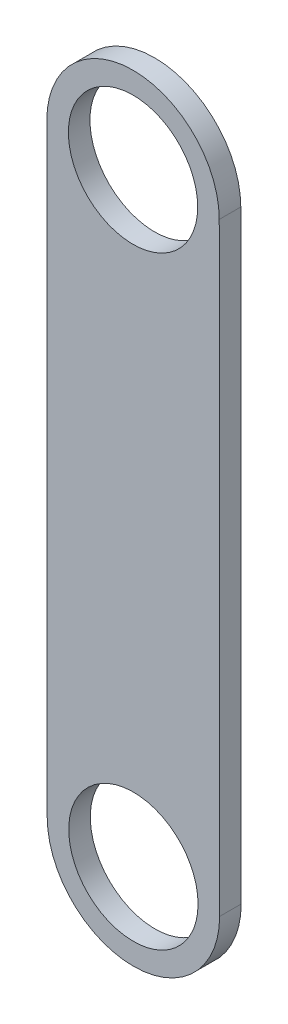
ISO-10303-21;
HEADER;
FILE_DESCRIPTION(('STEP AP214'),'2;1');
FILE_NAME('part.step','',(''),(''),'','','');
FILE_SCHEMA(('AUTOMOTIVE_DESIGN { 1 0 10303 214 1 1 1 1 }'));
ENDSEC;
DATA;
#1=APPLICATION_CONTEXT('core data for automotive mechanical design processes');
#2=APPLICATION_PROTOCOL_DEFINITION('international standard','automotive_design',2000,#1);
#3=PRODUCT_CONTEXT('',#1,'mechanical');
#4=PRODUCT('Part','Part','',(#3));
#5=PRODUCT_RELATED_PRODUCT_CATEGORY('part','',(#4));
#6=PRODUCT_DEFINITION_FORMATION('','',#4);
#7=PRODUCT_DEFINITION_CONTEXT('part definition',#1,'design');
#8=PRODUCT_DEFINITION('design','',#6,#7);
#9=PRODUCT_DEFINITION_SHAPE('','',#8);
#10=(LENGTH_UNIT() NAMED_UNIT(*) SI_UNIT(.MILLI.,.METRE.));
#11=(NAMED_UNIT(*) PLANE_ANGLE_UNIT() SI_UNIT($,.RADIAN.));
#12=(NAMED_UNIT(*) SI_UNIT($,.STERADIAN.) SOLID_ANGLE_UNIT());
#13=UNCERTAINTY_MEASURE_WITH_UNIT(LENGTH_MEASURE(1.E-05),#10,'distance_accuracy_value','');
#14=(GEOMETRIC_REPRESENTATION_CONTEXT(3) GLOBAL_UNCERTAINTY_ASSIGNED_CONTEXT((#13)) GLOBAL_UNIT_ASSIGNED_CONTEXT((#10,
#11,#12)) REPRESENTATION_CONTEXT('',''));
#15=CARTESIAN_POINT('',(0.,0.,0.));
#16=DIRECTION('',(0.,0.,1.));
#17=DIRECTION('',(1.,0.,0.));
#18=AXIS2_PLACEMENT_3D('',#15,#16,#17);
#19=CARTESIAN_POINT('',(-31.7651022120724,-5.87017847864854,-1.));
#20=DIRECTION('',(0.,0.,1.));
#21=DIRECTION('',(1.,0.,0.));
#22=AXIS2_PLACEMENT_3D('',#19,#20,#21);
#23=CYLINDRICAL_SURFACE('',#22,4.00000000000001);
#24=CARTESIAN_POINT('',(-31.7651022120724,-5.87017847864854,0.));
#25=DIRECTION('',(0.,0.,1.));
#26=DIRECTION('',(1.,0.,0.));
#27=AXIS2_PLACEMENT_3D('',#24,#25,#26);
#28=CIRCLE('',#27,4.00000000000001);
#29=CARTESIAN_POINT('',(-27.7651029568962,-5.86773745627963,0.));
#30=VERTEX_POINT('',#29);
#31=CARTESIAN_POINT('',(-35.7651014672485,-5.87261950101745,0.));
#32=VERTEX_POINT('',#31);
#33=EDGE_CURVE('E106',#30,#32,#28,.T.);
#34=ORIENTED_EDGE('',*,*,#33,.F.);
#35=DIRECTION('',(0.,0.,1.));
#36=VECTOR('',#35,1.);
#37=CARTESIAN_POINT('',(-27.7651029568962,-5.86773745627963,-1.));
#38=LINE('',#37,#36);
#39=CARTESIAN_POINT('',(-27.7651029568962,-5.86773745627963,-1.));
#40=VERTEX_POINT('',#39);
#41=EDGE_CURVE('E11',#40,#30,#38,.T.);
#42=ORIENTED_EDGE('',*,*,#41,.F.);
#43=CARTESIAN_POINT('',(-31.7651022120724,-5.87017847864854,-1.));
#44=DIRECTION('',(0.,0.,1.));
#45=DIRECTION('',(1.,0.,0.));
#46=AXIS2_PLACEMENT_3D('',#43,#44,#45);
#47=CIRCLE('',#46,4.00000000000001);
#48=CARTESIAN_POINT('',(-35.7651014672485,-5.87261950101745,-1.));
#49=VERTEX_POINT('',#48);
#50=EDGE_CURVE('E99',#40,#49,#47,.T.);
#51=ORIENTED_EDGE('',*,*,#50,.T.);
#52=DIRECTION('',(0.,0.,1.));
#53=VECTOR('',#52,1.);
#54=CARTESIAN_POINT('',(-35.7651014672485,-5.87261950101745,-1.));
#55=LINE('',#54,#53);
#56=EDGE_CURVE('E44',#49,#32,#55,.T.);
#57=ORIENTED_EDGE('',*,*,#56,.T.);
#58=EDGE_LOOP('',(#34,#42,#51,#57));
#59=FACE_BOUND('',#58,.T.);
#60=ADVANCED_FACE('F41',(#59),#23,.T.);
#61=CARTESIAN_POINT('',(-27.7651029568962,-5.86773745627963,-1.));
#62=DIRECTION('',(0.999999813794039,0.000610255592226298,0.));
#63=DIRECTION('',(-0.000610255592226298,0.999999813794039,0.));
#64=AXIS2_PLACEMENT_3D('',#61,#62,#63);
#65=PLANE('',#64);
#66=DIRECTION('',(-0.000610255592226298,0.999999813794039,0.));
#67=VECTOR('',#66,1.);
#68=CARTESIAN_POINT('',(-27.7651029568962,-5.86773745627963,0.));
#69=LINE('',#68,#67);
#70=CARTESIAN_POINT('',(-27.7480158003139,-33.8677322425127,0.));
#71=VERTEX_POINT('',#70);
#72=EDGE_CURVE('E101',#71,#30,#69,.T.);
#73=ORIENTED_EDGE('',*,*,#72,.F.);
#74=DIRECTION('',(0.,0.,1.));
#75=VECTOR('',#74,1.);
#76=CARTESIAN_POINT('',(-27.7480158003139,-33.8677322425127,-1.));
#77=LINE('',#76,#75);
#78=CARTESIAN_POINT('',(-27.7480158003139,-33.8677322425127,-1.));
#79=VERTEX_POINT('',#78);
#80=EDGE_CURVE('E50',#79,#71,#77,.T.);
#81=ORIENTED_EDGE('',*,*,#80,.F.);
#82=DIRECTION('',(-0.000610255592226298,0.999999813794039,0.));
#83=VECTOR('',#82,1.);
#84=CARTESIAN_POINT('',(-27.7651029568962,-5.86773745627963,-1.));
#85=LINE('',#84,#83);
#86=EDGE_CURVE('E96',#79,#40,#85,.T.);
#87=ORIENTED_EDGE('',*,*,#86,.T.);
#88=ORIENTED_EDGE('',*,*,#41,.T.);
#89=EDGE_LOOP('',(#73,#81,#87,#88));
#90=FACE_BOUND('',#89,.T.);
#91=ADVANCED_FACE('F117',(#90),#65,.T.);
#92=CARTESIAN_POINT('',(-31.74801505549,-33.8701732648816,-1.));
#93=DIRECTION('',(0.,0.,1.));
#94=DIRECTION('',(1.,0.,0.));
#95=AXIS2_PLACEMENT_3D('',#92,#93,#94);
#96=CYLINDRICAL_SURFACE('',#95,4.);
#97=CARTESIAN_POINT('',(-31.74801505549,-33.8701732648816,0.));
#98=DIRECTION('',(0.,0.,1.));
#99=DIRECTION('',(1.,0.,0.));
#100=AXIS2_PLACEMENT_3D('',#97,#98,#99);
#101=CIRCLE('',#100,4.);
#102=CARTESIAN_POINT('',(-35.7480143106662,-33.8726142872505,0.));
#103=VERTEX_POINT('',#102);
#104=EDGE_CURVE('E91',#103,#71,#101,.T.);
#105=ORIENTED_EDGE('',*,*,#104,.F.);
#106=DIRECTION('',(0.,0.,1.));
#107=VECTOR('',#106,1.);
#108=CARTESIAN_POINT('',(-35.7480143106662,-33.8726142872505,-1.));
#109=LINE('',#108,#107);
#110=CARTESIAN_POINT('',(-35.7480143106662,-33.8726142872505,-1.));
#111=VERTEX_POINT('',#110);
#112=EDGE_CURVE('E86',#111,#103,#109,.T.);
#113=ORIENTED_EDGE('',*,*,#112,.F.);
#114=CARTESIAN_POINT('',(-31.74801505549,-33.8701732648816,-1.));
#115=DIRECTION('',(0.,0.,1.));
#116=DIRECTION('',(1.,0.,0.));
#117=AXIS2_PLACEMENT_3D('',#114,#115,#116);
#118=CIRCLE('',#117,4.);
#119=EDGE_CURVE('E89',#111,#79,#118,.T.);
#120=ORIENTED_EDGE('',*,*,#119,.T.);
#121=ORIENTED_EDGE('',*,*,#80,.T.);
#122=EDGE_LOOP('',(#105,#113,#120,#121));
#123=FACE_BOUND('',#122,.T.);
#124=ADVANCED_FACE('F88',(#123),#96,.T.);
#125=CARTESIAN_POINT('',(-35.7651014672485,-5.87261950101745,-1.));
#126=DIRECTION('',(-0.999999813794039,-0.000610255592226794,0.));
#127=DIRECTION('',(0.000610255592226794,-0.999999813794039,0.));
#128=AXIS2_PLACEMENT_3D('',#125,#126,#127);
#129=PLANE('',#128);
#130=DIRECTION('',(0.000610255592226794,-0.999999813794039,0.));
#131=VECTOR('',#130,1.);
#132=CARTESIAN_POINT('',(-35.7651014672485,-5.87261950101745,0.));
#133=LINE('',#132,#131);
#134=EDGE_CURVE('E109',#32,#103,#133,.T.);
#135=ORIENTED_EDGE('',*,*,#134,.F.);
#136=ORIENTED_EDGE('',*,*,#56,.F.);
#137=DIRECTION('',(0.000610255592226794,-0.999999813794039,0.));
#138=VECTOR('',#137,1.);
#139=CARTESIAN_POINT('',(-35.7651014672485,-5.87261950101745,-1.));
#140=LINE('',#139,#138);
#141=EDGE_CURVE('E95',#49,#111,#140,.T.);
#142=ORIENTED_EDGE('',*,*,#141,.T.);
#143=ORIENTED_EDGE('',*,*,#112,.T.);
#144=EDGE_LOOP('',(#135,#136,#142,#143));
#145=FACE_BOUND('',#144,.T.);
#146=ADVANCED_FACE('F98',(#145),#129,.T.);
#147=CARTESIAN_POINT('',(-31.7651022120724,-5.87017847864854,-1.));
#148=DIRECTION('',(0.,0.,1.));
#149=DIRECTION('',(1.,0.,0.));
#150=AXIS2_PLACEMENT_3D('',#147,#148,#149);
#151=PLANE('',#150);
#152=CARTESIAN_POINT('',(-31.74801505549,-33.8701732648816,-1.));
#153=DIRECTION('',(0.,0.,1.));
#154=DIRECTION('',(1.,0.,0.));
#155=AXIS2_PLACEMENT_3D('',#152,#153,#154);
#156=CIRCLE('',#155,3.);
#157=CARTESIAN_POINT('',(-28.74801505549,-33.8701732648816,-1.));
#158=VERTEX_POINT('',#157);
#159=EDGE_CURVE('E150',#158,#158,#156,.T.);
#160=ORIENTED_EDGE('',*,*,#159,.T.);
#161=EDGE_LOOP('',(#160));
#162=FACE_BOUND('',#161,.T.);
#163=CARTESIAN_POINT('',(-31.7651022120724,-5.87017847864854,-1.));
#164=DIRECTION('',(0.,0.,1.));
#165=DIRECTION('',(1.,0.,0.));
#166=AXIS2_PLACEMENT_3D('',#163,#164,#165);
#167=CIRCLE('',#166,3.);
#168=CARTESIAN_POINT('',(-28.7651022120724,-5.87017847864854,-1.));
#169=VERTEX_POINT('',#168);
#170=EDGE_CURVE('E110',#169,#169,#167,.T.);
#171=ORIENTED_EDGE('',*,*,#170,.T.);
#172=EDGE_LOOP('',(#171));
#173=FACE_BOUND('',#172,.T.);
#174=ORIENTED_EDGE('',*,*,#50,.F.);
#175=ORIENTED_EDGE('',*,*,#86,.F.);
#176=ORIENTED_EDGE('',*,*,#119,.F.);
#177=ORIENTED_EDGE('',*,*,#141,.F.);
#178=EDGE_LOOP('',(#174,#175,#176,#177));
#179=FACE_BOUND('',#178,.T.);
#180=ADVANCED_FACE('F94',(#162,#173,#179),#151,.F.);
#181=CARTESIAN_POINT('',(-31.7651022120724,-5.87017847864854,0.));
#182=DIRECTION('',(0.,0.,1.));
#183=DIRECTION('',(1.,0.,0.));
#184=AXIS2_PLACEMENT_3D('',#181,#182,#183);
#185=PLANE('',#184);
#186=CARTESIAN_POINT('',(-31.74801505549,-33.8701732648816,0.));
#187=DIRECTION('',(0.,0.,1.));
#188=DIRECTION('',(1.,0.,0.));
#189=AXIS2_PLACEMENT_3D('',#186,#187,#188);
#190=CIRCLE('',#189,3.);
#191=CARTESIAN_POINT('',(-28.74801505549,-33.8701732648816,0.));
#192=VERTEX_POINT('',#191);
#193=EDGE_CURVE('E153',#192,#192,#190,.T.);
#194=ORIENTED_EDGE('',*,*,#193,.F.);
#195=EDGE_LOOP('',(#194));
#196=FACE_BOUND('',#195,.T.);
#197=CARTESIAN_POINT('',(-31.7651022120724,-5.87017847864854,0.));
#198=DIRECTION('',(0.,0.,1.));
#199=DIRECTION('',(1.,0.,0.));
#200=AXIS2_PLACEMENT_3D('',#197,#198,#199);
#201=CIRCLE('',#200,3.);
#202=CARTESIAN_POINT('',(-28.7651022120724,-5.87017847864854,0.));
#203=VERTEX_POINT('',#202);
#204=EDGE_CURVE('E155',#203,#203,#201,.T.);
#205=ORIENTED_EDGE('',*,*,#204,.F.);
#206=EDGE_LOOP('',(#205));
#207=FACE_BOUND('',#206,.T.);
#208=ORIENTED_EDGE('',*,*,#33,.T.);
#209=ORIENTED_EDGE('',*,*,#134,.T.);
#210=ORIENTED_EDGE('',*,*,#104,.T.);
#211=ORIENTED_EDGE('',*,*,#72,.T.);
#212=EDGE_LOOP('',(#208,#209,#210,#211));
#213=FACE_BOUND('',#212,.T.);
#214=ADVANCED_FACE('F116',(#196,#207,#213),#185,.T.);
#215=CARTESIAN_POINT('',(-31.7651022120724,-5.87017847864854,-1.));
#216=DIRECTION('',(0.,0.,1.));
#217=DIRECTION('',(1.,0.,0.));
#218=AXIS2_PLACEMENT_3D('',#215,#216,#217);
#219=CYLINDRICAL_SURFACE('',#218,3.);
#220=ORIENTED_EDGE('',*,*,#170,.F.);
#221=EDGE_LOOP('',(#220));
#222=FACE_BOUND('',#221,.T.);
#223=ORIENTED_EDGE('',*,*,#204,.T.);
#224=EDGE_LOOP('',(#223));
#225=FACE_BOUND('',#224,.T.);
#226=ADVANCED_FACE('F135',(#222,#225),#219,.F.);
#227=CARTESIAN_POINT('',(-31.74801505549,-33.8701732648816,-1.));
#228=DIRECTION('',(0.,0.,1.));
#229=DIRECTION('',(1.,0.,0.));
#230=AXIS2_PLACEMENT_3D('',#227,#228,#229);
#231=CYLINDRICAL_SURFACE('',#230,3.);
#232=ORIENTED_EDGE('',*,*,#159,.F.);
#233=EDGE_LOOP('',(#232));
#234=FACE_BOUND('',#233,.T.);
#235=ORIENTED_EDGE('',*,*,#193,.T.);
#236=EDGE_LOOP('',(#235));
#237=FACE_BOUND('',#236,.T.);
#238=ADVANCED_FACE('F142',(#234,#237),#231,.F.);
#239=CLOSED_SHELL('',(#60,#91,#124,#146,#180,#214,#226,#238));
#240=MANIFOLD_SOLID_BREP('B2',#239);
#241=ADVANCED_BREP_SHAPE_REPRESENTATION('',(#18,#240),#14);
#242=SHAPE_DEFINITION_REPRESENTATION(#9,#241);
ENDSEC;
END-ISO-10303-21;
